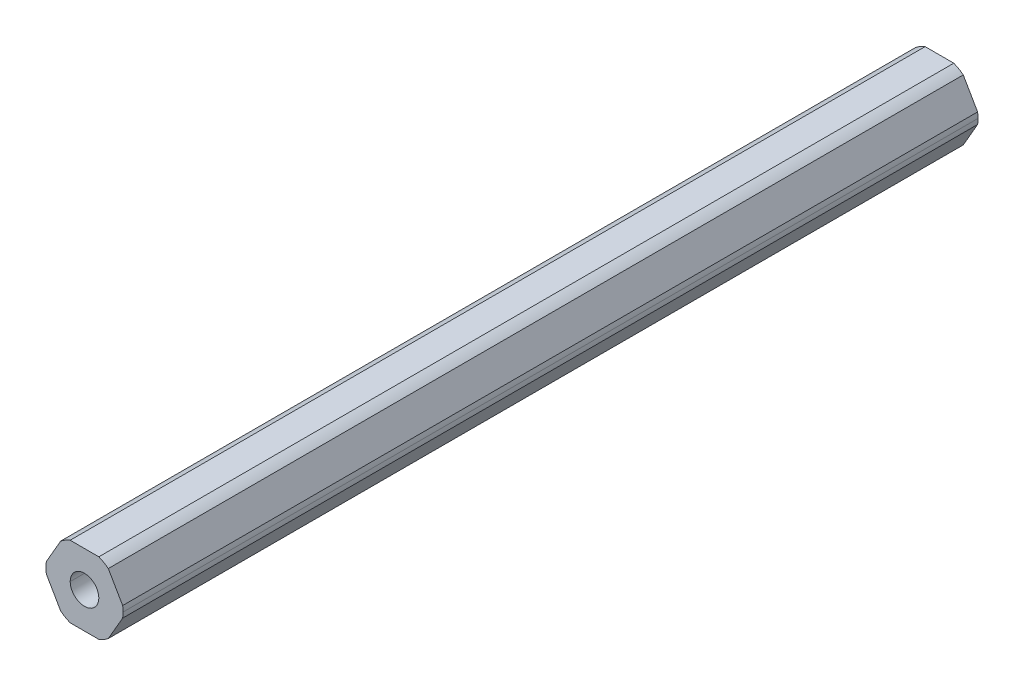
ISO-10303-21;
HEADER;
FILE_DESCRIPTION(('STEP AP214'),'2;1');
FILE_NAME('part.step','',(''),(''),'','','');
FILE_SCHEMA(('AUTOMOTIVE_DESIGN { 1 0 10303 214 1 1 1 1 }'));
ENDSEC;
DATA;
#1=APPLICATION_CONTEXT('core data for automotive mechanical design processes');
#2=APPLICATION_PROTOCOL_DEFINITION('international standard','automotive_design',2000,#1);
#3=PRODUCT_CONTEXT('',#1,'mechanical');
#4=PRODUCT('Part','Part','',(#3));
#5=PRODUCT_RELATED_PRODUCT_CATEGORY('part','',(#4));
#6=PRODUCT_DEFINITION_FORMATION('','',#4);
#7=PRODUCT_DEFINITION_CONTEXT('part definition',#1,'design');
#8=PRODUCT_DEFINITION('design','',#6,#7);
#9=PRODUCT_DEFINITION_SHAPE('','',#8);
#10=(LENGTH_UNIT() NAMED_UNIT(*) SI_UNIT(.MILLI.,.METRE.));
#11=(NAMED_UNIT(*) PLANE_ANGLE_UNIT() SI_UNIT($,.RADIAN.));
#12=(NAMED_UNIT(*) SI_UNIT($,.STERADIAN.) SOLID_ANGLE_UNIT());
#13=UNCERTAINTY_MEASURE_WITH_UNIT(LENGTH_MEASURE(1.E-05),#10,'distance_accuracy_value','');
#14=(GEOMETRIC_REPRESENTATION_CONTEXT(3) GLOBAL_UNCERTAINTY_ASSIGNED_CONTEXT((#13)) GLOBAL_UNIT_ASSIGNED_CONTEXT((#10,
#11,#12)) REPRESENTATION_CONTEXT('',''));
#15=CARTESIAN_POINT('',(0.,0.,0.));
#16=DIRECTION('',(0.,0.,1.));
#17=DIRECTION('',(1.,0.,0.));
#18=AXIS2_PLACEMENT_3D('',#15,#16,#17);
#19=CARTESIAN_POINT('',(0.,0.,-457.2));
#20=DIRECTION('',(0.,0.,1.));
#21=DIRECTION('',(1.,0.,0.));
#22=AXIS2_PLACEMENT_3D('',#19,#20,#21);
#23=CYLINDRICAL_SURFACE('',#22,2.55);
#24=CARTESIAN_POINT('',(0.,0.,-304.8));
#25=DIRECTION('',(0.,0.,1.));
#26=DIRECTION('',(1.,0.,0.));
#27=AXIS2_PLACEMENT_3D('',#24,#25,#26);
#28=CIRCLE('',#27,2.55);
#29=CARTESIAN_POINT('',(2.55,0.,-304.8));
#30=VERTEX_POINT('',#29);
#31=CARTESIAN_POINT('',(-2.55,0.,-304.8));
#32=VERTEX_POINT('',#31);
#33=EDGE_CURVE('E65',#30,#32,#28,.F.);
#34=ORIENTED_EDGE('',*,*,#33,.F.);
#35=DIRECTION('',(0.,0.,1.));
#36=VECTOR('',#35,1.);
#37=CARTESIAN_POINT('',(2.55,0.,-457.2));
#38=LINE('',#37,#36);
#39=CARTESIAN_POINT('',(2.55,0.,-457.2));
#40=VERTEX_POINT('',#39);
#41=EDGE_CURVE('E168',#40,#30,#38,.T.);
#42=ORIENTED_EDGE('',*,*,#41,.F.);
#43=CARTESIAN_POINT('',(0.,0.,-457.2));
#44=DIRECTION('',(0.,0.,1.));
#45=DIRECTION('',(1.,0.,0.));
#46=AXIS2_PLACEMENT_3D('',#43,#44,#45);
#47=CIRCLE('',#46,2.55);
#48=CARTESIAN_POINT('',(-2.55,0.,-457.2));
#49=VERTEX_POINT('',#48);
#50=EDGE_CURVE('E215',#49,#40,#47,.T.);
#51=ORIENTED_EDGE('',*,*,#50,.F.);
#52=DIRECTION('',(0.,0.,1.));
#53=VECTOR('',#52,1.);
#54=CARTESIAN_POINT('',(-2.55,0.,-457.2));
#55=LINE('',#54,#53);
#56=EDGE_CURVE('E52',#49,#32,#55,.T.);
#57=ORIENTED_EDGE('',*,*,#56,.T.);
#58=EDGE_LOOP('',(#34,#42,#51,#57));
#59=FACE_BOUND('',#58,.T.);
#60=ADVANCED_FACE('F44',(#59),#23,.F.);
#61=CARTESIAN_POINT('',(0.,0.,-457.2));
#62=DIRECTION('',(0.,0.,1.));
#63=DIRECTION('',(1.,0.,0.));
#64=AXIS2_PLACEMENT_3D('',#61,#62,#63);
#65=CYLINDRICAL_SURFACE('',#64,6.87);
#66=DIRECTION('',(0.,0.,1.));
#67=VECTOR('',#66,1.);
#68=CARTESIAN_POINT('',(6.87,0.,-457.2));
#69=LINE('',#68,#67);
#70=CARTESIAN_POINT('',(6.87,0.,-457.2));
#71=VERTEX_POINT('',#70);
#72=CARTESIAN_POINT('',(6.87,0.,-304.8));
#73=VERTEX_POINT('',#72);
#74=EDGE_CURVE('E232',#71,#73,#69,.T.);
#75=ORIENTED_EDGE('',*,*,#74,.T.);
#76=CARTESIAN_POINT('',(0.,0.,-304.8));
#77=DIRECTION('',(0.,0.,1.));
#78=DIRECTION('',(1.,0.,0.));
#79=AXIS2_PLACEMENT_3D('',#76,#77,#78);
#80=CIRCLE('',#79,6.87);
#81=CARTESIAN_POINT('',(6.80102150534208,-0.971085209378955,-304.8));
#82=VERTEX_POINT('',#81);
#83=EDGE_CURVE('E325',#73,#82,#80,.F.);
#84=ORIENTED_EDGE('',*,*,#83,.T.);
#85=DIRECTION('',(0.,0.,-1.));
#86=VECTOR('',#85,1.);
#87=CARTESIAN_POINT('',(6.80102150534208,-0.971085209378962,-457.2));
#88=LINE('',#87,#86);
#89=CARTESIAN_POINT('',(6.80102150534208,-0.971085209378955,-457.2));
#90=VERTEX_POINT('',#89);
#91=EDGE_CURVE('E230',#82,#90,#88,.T.);
#92=ORIENTED_EDGE('',*,*,#91,.T.);
#93=CARTESIAN_POINT('',(0.,0.,-457.2));
#94=DIRECTION('',(0.,0.,1.));
#95=DIRECTION('',(1.,0.,0.));
#96=AXIS2_PLACEMENT_3D('',#93,#94,#95);
#97=CIRCLE('',#96,6.87);
#98=EDGE_CURVE('E236',#90,#71,#97,.T.);
#99=ORIENTED_EDGE('',*,*,#98,.T.);
#100=EDGE_LOOP('',(#75,#84,#92,#99));
#101=FACE_BOUND('',#100,.T.);
#102=ADVANCED_FACE('F365',(#101),#65,.T.);
#103=CARTESIAN_POINT('',(3.68083890619154,-6.3754,457.2));
#104=DIRECTION('',(-0.866025403784439,0.5,0.));
#105=DIRECTION('',(0.,0.,1.));
#106=AXIS2_PLACEMENT_3D('',#103,#104,#105);
#107=PLANE('',#106);
#108=DIRECTION('',(0.5,0.866025403784439,0.));
#109=VECTOR('',#108,1.);
#110=CARTESIAN_POINT('',(3.68083890619154,-6.3754,-304.8));
#111=LINE('',#110,#109);
#112=CARTESIAN_POINT('',(4.24149521323254,-5.40431479062105,-304.8));
#113=VERTEX_POINT('',#112);
#114=EDGE_CURVE('E318',#113,#82,#111,.T.);
#115=ORIENTED_EDGE('',*,*,#114,.F.);
#116=DIRECTION('',(0.,0.,1.));
#117=VECTOR('',#116,1.);
#118=CARTESIAN_POINT('',(4.24149521323255,-5.40431479062104,-457.2));
#119=LINE('',#118,#117);
#120=CARTESIAN_POINT('',(4.24149521323254,-5.40431479062105,-457.2));
#121=VERTEX_POINT('',#120);
#122=EDGE_CURVE('E225',#121,#113,#119,.T.);
#123=ORIENTED_EDGE('',*,*,#122,.F.);
#124=DIRECTION('',(0.5,0.866025403784439,0.));
#125=VECTOR('',#124,1.);
#126=CARTESIAN_POINT('',(3.68083890619154,-6.3754,-457.2));
#127=LINE('',#126,#125);
#128=EDGE_CURVE('E206',#121,#90,#127,.T.);
#129=ORIENTED_EDGE('',*,*,#128,.T.);
#130=ORIENTED_EDGE('',*,*,#91,.F.);
#131=EDGE_LOOP('',(#115,#123,#129,#130));
#132=FACE_BOUND('',#131,.T.);
#133=ADVANCED_FACE('F363',(#132),#107,.F.);
#134=CARTESIAN_POINT('',(7.36167781238308,0.,457.2));
#135=DIRECTION('',(-0.866025403784439,-0.5,0.));
#136=DIRECTION('',(-0.5,0.866025403784439,0.));
#137=AXIS2_PLACEMENT_3D('',#134,#135,#136);
#138=PLANE('',#137);
#139=DIRECTION('',(-0.5,0.866025403784439,0.));
#140=VECTOR('',#139,1.);
#141=CARTESIAN_POINT('',(7.36167781238308,0.,-304.8));
#142=LINE('',#141,#140);
#143=CARTESIAN_POINT('',(6.80102150534208,0.97108520937895,-304.8));
#144=VERTEX_POINT('',#143);
#145=CARTESIAN_POINT('',(4.24149521323254,5.40431479062105,-304.8));
#146=VERTEX_POINT('',#145);
#147=EDGE_CURVE('E59',#144,#146,#142,.T.);
#148=ORIENTED_EDGE('',*,*,#147,.F.);
#149=DIRECTION('',(0.,0.,1.));
#150=VECTOR('',#149,1.);
#151=CARTESIAN_POINT('',(6.80102150534208,0.971085209378949,-457.2));
#152=LINE('',#151,#150);
#153=CARTESIAN_POINT('',(6.80102150534208,0.97108520937895,-457.2));
#154=VERTEX_POINT('',#153);
#155=EDGE_CURVE('E229',#154,#144,#152,.T.);
#156=ORIENTED_EDGE('',*,*,#155,.F.);
#157=DIRECTION('',(-0.5,0.866025403784439,0.));
#158=VECTOR('',#157,1.);
#159=CARTESIAN_POINT('',(7.36167781238308,0.,-457.2));
#160=LINE('',#159,#158);
#161=CARTESIAN_POINT('',(4.24149521323254,5.40431479062105,-457.2));
#162=VERTEX_POINT('',#161);
#163=EDGE_CURVE('E202',#154,#162,#160,.T.);
#164=ORIENTED_EDGE('',*,*,#163,.T.);
#165=DIRECTION('',(0.,0.,-1.));
#166=VECTOR('',#165,1.);
#167=CARTESIAN_POINT('',(4.24149521323254,5.40431479062105,-457.2));
#168=LINE('',#167,#166);
#169=EDGE_CURVE('E190',#146,#162,#168,.T.);
#170=ORIENTED_EDGE('',*,*,#169,.F.);
#171=EDGE_LOOP('',(#148,#156,#164,#170));
#172=FACE_BOUND('',#171,.T.);
#173=ADVANCED_FACE('F260',(#172),#138,.F.);
#174=CARTESIAN_POINT('',(3.68083890619154,6.3754,457.2));
#175=DIRECTION('',(0.,-1.,0.));
#176=DIRECTION('',(0.,0.,-1.));
#177=AXIS2_PLACEMENT_3D('',#174,#175,#176);
#178=PLANE('',#177);
#179=DIRECTION('',(-1.,0.,0.));
#180=VECTOR('',#179,1.);
#181=CARTESIAN_POINT('',(3.68083890619154,6.3754,-304.8));
#182=LINE('',#181,#180);
#183=CARTESIAN_POINT('',(2.55952629210953,6.3754,-304.8));
#184=VERTEX_POINT('',#183);
#185=CARTESIAN_POINT('',(-2.55952629210953,6.3754,-304.8));
#186=VERTEX_POINT('',#185);
#187=EDGE_CURVE('E335',#184,#186,#182,.T.);
#188=ORIENTED_EDGE('',*,*,#187,.F.);
#189=DIRECTION('',(0.,0.,1.));
#190=VECTOR('',#189,1.);
#191=CARTESIAN_POINT('',(2.55952629210952,6.3754,-457.2));
#192=LINE('',#191,#190);
#193=CARTESIAN_POINT('',(2.55952629210952,6.3754,-457.2));
#194=VERTEX_POINT('',#193);
#195=EDGE_CURVE('E177',#194,#184,#192,.T.);
#196=ORIENTED_EDGE('',*,*,#195,.F.);
#197=DIRECTION('',(-1.,0.,0.));
#198=VECTOR('',#197,1.);
#199=CARTESIAN_POINT('',(3.68083890619154,6.3754,-457.2));
#200=LINE('',#199,#198);
#201=CARTESIAN_POINT('',(-2.55952629210953,6.3754,-457.2));
#202=VERTEX_POINT('',#201);
#203=EDGE_CURVE('E207',#194,#202,#200,.T.);
#204=ORIENTED_EDGE('',*,*,#203,.T.);
#205=DIRECTION('',(0.,0.,-1.));
#206=VECTOR('',#205,1.);
#207=CARTESIAN_POINT('',(-2.55952629210953,6.3754,-457.2));
#208=LINE('',#207,#206);
#209=EDGE_CURVE('E192',#186,#202,#208,.T.);
#210=ORIENTED_EDGE('',*,*,#209,.F.);
#211=EDGE_LOOP('',(#188,#196,#204,#210));
#212=FACE_BOUND('',#211,.T.);
#213=ADVANCED_FACE('F341',(#212),#178,.F.);
#214=CARTESIAN_POINT('',(-3.68083890619154,6.3754,457.2));
#215=DIRECTION('',(0.866025403784439,-0.5,0.));
#216=DIRECTION('',(0.,0.,-1.));
#217=AXIS2_PLACEMENT_3D('',#214,#215,#216);
#218=PLANE('',#217);
#219=DIRECTION('',(-0.5,-0.866025403784439,0.));
#220=VECTOR('',#219,1.);
#221=CARTESIAN_POINT('',(-3.68083890619154,6.3754,-304.8));
#222=LINE('',#221,#220);
#223=CARTESIAN_POINT('',(-4.24149521323255,5.40431479062105,-304.8));
#224=VERTEX_POINT('',#223);
#225=CARTESIAN_POINT('',(-6.80102150534207,0.97108520937896,-304.8));
#226=VERTEX_POINT('',#225);
#227=EDGE_CURVE('E328',#224,#226,#222,.T.);
#228=ORIENTED_EDGE('',*,*,#227,.F.);
#229=DIRECTION('',(0.,0.,1.));
#230=VECTOR('',#229,1.);
#231=CARTESIAN_POINT('',(-4.24149521323255,5.40431479062105,-457.2));
#232=LINE('',#231,#230);
#233=CARTESIAN_POINT('',(-4.24149521323255,5.40431479062105,-457.2));
#234=VERTEX_POINT('',#233);
#235=EDGE_CURVE('E275',#234,#224,#232,.T.);
#236=ORIENTED_EDGE('',*,*,#235,.F.);
#237=DIRECTION('',(-0.5,-0.866025403784439,0.));
#238=VECTOR('',#237,1.);
#239=CARTESIAN_POINT('',(-3.68083890619154,6.3754,-457.2));
#240=LINE('',#239,#238);
#241=CARTESIAN_POINT('',(-6.80102150534208,0.97108520937896,-457.2));
#242=VERTEX_POINT('',#241);
#243=EDGE_CURVE('E211',#234,#242,#240,.T.);
#244=ORIENTED_EDGE('',*,*,#243,.T.);
#245=DIRECTION('',(0.,0.,-1.));
#246=VECTOR('',#245,1.);
#247=CARTESIAN_POINT('',(-6.80102150534208,0.97108520937896,-457.2));
#248=LINE('',#247,#246);
#249=EDGE_CURVE('E221',#226,#242,#248,.T.);
#250=ORIENTED_EDGE('',*,*,#249,.F.);
#251=EDGE_LOOP('',(#228,#236,#244,#250));
#252=FACE_BOUND('',#251,.T.);
#253=ADVANCED_FACE('F347',(#252),#218,.F.);
#254=CARTESIAN_POINT('',(-7.36167781238308,0.,457.2));
#255=DIRECTION('',(0.866025403784439,0.5,0.));
#256=DIRECTION('',(0.,0.,-1.));
#257=AXIS2_PLACEMENT_3D('',#254,#255,#256);
#258=PLANE('',#257);
#259=DIRECTION('',(0.5,-0.866025403784439,0.));
#260=VECTOR('',#259,1.);
#261=CARTESIAN_POINT('',(-7.36167781238308,0.,-304.8));
#262=LINE('',#261,#260);
#263=CARTESIAN_POINT('',(-6.80102150534208,-0.971085209378956,-304.8));
#264=VERTEX_POINT('',#263);
#265=CARTESIAN_POINT('',(-4.24149521323254,-5.40431479062105,-304.8));
#266=VERTEX_POINT('',#265);
#267=EDGE_CURVE('E320',#264,#266,#262,.T.);
#268=ORIENTED_EDGE('',*,*,#267,.F.);
#269=DIRECTION('',(0.,0.,1.));
#270=VECTOR('',#269,1.);
#271=CARTESIAN_POINT('',(-6.80102150534208,-0.971085209378962,-457.2));
#272=LINE('',#271,#270);
#273=CARTESIAN_POINT('',(-6.80102150534208,-0.971085209378956,-457.2));
#274=VERTEX_POINT('',#273);
#275=EDGE_CURVE('E193',#274,#264,#272,.T.);
#276=ORIENTED_EDGE('',*,*,#275,.F.);
#277=DIRECTION('',(0.5,-0.866025403784439,0.));
#278=VECTOR('',#277,1.);
#279=CARTESIAN_POINT('',(-7.36167781238308,0.,-457.2));
#280=LINE('',#279,#278);
#281=CARTESIAN_POINT('',(-4.24149521323254,-5.40431479062105,-457.2));
#282=VERTEX_POINT('',#281);
#283=EDGE_CURVE('E284',#274,#282,#280,.T.);
#284=ORIENTED_EDGE('',*,*,#283,.T.);
#285=DIRECTION('',(0.,0.,-1.));
#286=VECTOR('',#285,1.);
#287=CARTESIAN_POINT('',(-4.24149521323255,-5.40431479062104,-457.2));
#288=LINE('',#287,#286);
#289=EDGE_CURVE('E201',#266,#282,#288,.T.);
#290=ORIENTED_EDGE('',*,*,#289,.F.);
#291=EDGE_LOOP('',(#268,#276,#284,#290));
#292=FACE_BOUND('',#291,.T.);
#293=ADVANCED_FACE('F353',(#292),#258,.F.);
#294=CARTESIAN_POINT('',(-3.68083890619154,-6.3754,457.2));
#295=DIRECTION('',(0.,1.,0.));
#296=DIRECTION('',(1.,0.,0.));
#297=AXIS2_PLACEMENT_3D('',#294,#295,#296);
#298=PLANE('',#297);
#299=DIRECTION('',(1.,0.,0.));
#300=VECTOR('',#299,1.);
#301=CARTESIAN_POINT('',(-3.68083890619154,-6.3754,-304.8));
#302=LINE('',#301,#300);
#303=CARTESIAN_POINT('',(-2.55952629210953,-6.3754,-304.8));
#304=VERTEX_POINT('',#303);
#305=CARTESIAN_POINT('',(2.55952629210953,-6.3754,-304.8));
#306=VERTEX_POINT('',#305);
#307=EDGE_CURVE('E178',#304,#306,#302,.T.);
#308=ORIENTED_EDGE('',*,*,#307,.F.);
#309=DIRECTION('',(0.,0.,1.));
#310=VECTOR('',#309,1.);
#311=CARTESIAN_POINT('',(-2.55952629210953,-6.3754,-457.2));
#312=LINE('',#311,#310);
#313=CARTESIAN_POINT('',(-2.55952629210953,-6.3754,-457.2));
#314=VERTEX_POINT('',#313);
#315=EDGE_CURVE('E216',#314,#304,#312,.T.);
#316=ORIENTED_EDGE('',*,*,#315,.F.);
#317=DIRECTION('',(1.,0.,0.));
#318=VECTOR('',#317,1.);
#319=CARTESIAN_POINT('',(-3.68083890619154,-6.3754,-457.2));
#320=LINE('',#319,#318);
#321=CARTESIAN_POINT('',(2.55952629210953,-6.3754,-457.2));
#322=VERTEX_POINT('',#321);
#323=EDGE_CURVE('E214',#314,#322,#320,.T.);
#324=ORIENTED_EDGE('',*,*,#323,.T.);
#325=DIRECTION('',(0.,0.,-1.));
#326=VECTOR('',#325,1.);
#327=CARTESIAN_POINT('',(2.55952629210953,-6.3754,-457.2));
#328=LINE('',#327,#326);
#329=EDGE_CURVE('E200',#306,#322,#328,.T.);
#330=ORIENTED_EDGE('',*,*,#329,.F.);
#331=EDGE_LOOP('',(#308,#316,#324,#330));
#332=FACE_BOUND('',#331,.T.);
#333=ADVANCED_FACE('F357',(#332),#298,.F.);
#334=CARTESIAN_POINT('',(0.,0.,-457.2));
#335=DIRECTION('',(0.,0.,1.));
#336=DIRECTION('',(1.,0.,0.));
#337=AXIS2_PLACEMENT_3D('',#334,#335,#336);
#338=CYLINDRICAL_SURFACE('',#337,6.87);
#339=ORIENTED_EDGE('',*,*,#155,.T.);
#340=CARTESIAN_POINT('',(0.,0.,-304.8));
#341=DIRECTION('',(0.,0.,1.));
#342=DIRECTION('',(1.,0.,0.));
#343=AXIS2_PLACEMENT_3D('',#340,#341,#342);
#344=CIRCLE('',#343,6.87);
#345=EDGE_CURVE('E257',#144,#73,#344,.F.);
#346=ORIENTED_EDGE('',*,*,#345,.T.);
#347=ORIENTED_EDGE('',*,*,#74,.F.);
#348=CARTESIAN_POINT('',(0.,0.,-457.2));
#349=DIRECTION('',(0.,0.,1.));
#350=DIRECTION('',(1.,0.,0.));
#351=AXIS2_PLACEMENT_3D('',#348,#349,#350);
#352=CIRCLE('',#351,6.87);
#353=EDGE_CURVE('E224',#71,#154,#352,.T.);
#354=ORIENTED_EDGE('',*,*,#353,.T.);
#355=EDGE_LOOP('',(#339,#346,#347,#354));
#356=FACE_BOUND('',#355,.T.);
#357=ADVANCED_FACE('F256',(#356),#338,.T.);
#358=CARTESIAN_POINT('',(0.,0.,-457.2));
#359=DIRECTION('',(0.,0.,1.));
#360=DIRECTION('',(1.,0.,0.));
#361=AXIS2_PLACEMENT_3D('',#358,#359,#360);
#362=CYLINDRICAL_SURFACE('',#361,6.87);
#363=ORIENTED_EDGE('',*,*,#122,.T.);
#364=CARTESIAN_POINT('',(0.,0.,-304.8));
#365=DIRECTION('',(0.,0.,1.));
#366=DIRECTION('',(1.,0.,0.));
#367=AXIS2_PLACEMENT_3D('',#364,#365,#366);
#368=CIRCLE('',#367,6.87);
#369=EDGE_CURVE('E186',#113,#306,#368,.F.);
#370=ORIENTED_EDGE('',*,*,#369,.T.);
#371=ORIENTED_EDGE('',*,*,#329,.T.);
#372=CARTESIAN_POINT('',(0.,0.,-457.2));
#373=DIRECTION('',(0.,0.,1.));
#374=DIRECTION('',(1.,0.,0.));
#375=AXIS2_PLACEMENT_3D('',#372,#373,#374);
#376=CIRCLE('',#375,6.87);
#377=EDGE_CURVE('E196',#322,#121,#376,.T.);
#378=ORIENTED_EDGE('',*,*,#377,.T.);
#379=EDGE_LOOP('',(#363,#370,#371,#378));
#380=FACE_BOUND('',#379,.T.);
#381=ADVANCED_FACE('F359',(#380),#362,.T.);
#382=CARTESIAN_POINT('',(0.,0.,-457.2));
#383=DIRECTION('',(0.,0.,1.));
#384=DIRECTION('',(1.,0.,0.));
#385=AXIS2_PLACEMENT_3D('',#382,#383,#384);
#386=CYLINDRICAL_SURFACE('',#385,6.87);
#387=ORIENTED_EDGE('',*,*,#315,.T.);
#388=CARTESIAN_POINT('',(0.,0.,-304.8));
#389=DIRECTION('',(0.,0.,1.));
#390=DIRECTION('',(1.,0.,0.));
#391=AXIS2_PLACEMENT_3D('',#388,#389,#390);
#392=CIRCLE('',#391,6.87);
#393=EDGE_CURVE('E315',#304,#266,#392,.F.);
#394=ORIENTED_EDGE('',*,*,#393,.T.);
#395=ORIENTED_EDGE('',*,*,#289,.T.);
#396=CARTESIAN_POINT('',(0.,0.,-457.2));
#397=DIRECTION('',(0.,0.,1.));
#398=DIRECTION('',(1.,0.,0.));
#399=AXIS2_PLACEMENT_3D('',#396,#397,#398);
#400=CIRCLE('',#399,6.87);
#401=EDGE_CURVE('E220',#282,#314,#400,.T.);
#402=ORIENTED_EDGE('',*,*,#401,.T.);
#403=EDGE_LOOP('',(#387,#394,#395,#402));
#404=FACE_BOUND('',#403,.T.);
#405=ADVANCED_FACE('F355',(#404),#386,.T.);
#406=CARTESIAN_POINT('',(0.,0.,-457.2));
#407=DIRECTION('',(0.,0.,1.));
#408=DIRECTION('',(1.,0.,0.));
#409=AXIS2_PLACEMENT_3D('',#406,#407,#408);
#410=CYLINDRICAL_SURFACE('',#409,6.87);
#411=ORIENTED_EDGE('',*,*,#275,.T.);
#412=CARTESIAN_POINT('',(0.,0.,-304.8));
#413=DIRECTION('',(0.,0.,1.));
#414=DIRECTION('',(1.,0.,0.));
#415=AXIS2_PLACEMENT_3D('',#412,#413,#414);
#416=CIRCLE('',#415,6.87);
#417=EDGE_CURVE('E322',#264,#226,#416,.F.);
#418=ORIENTED_EDGE('',*,*,#417,.T.);
#419=ORIENTED_EDGE('',*,*,#249,.T.);
#420=CARTESIAN_POINT('',(0.,0.,-457.2));
#421=DIRECTION('',(0.,0.,1.));
#422=DIRECTION('',(1.,0.,0.));
#423=AXIS2_PLACEMENT_3D('',#420,#421,#422);
#424=CIRCLE('',#423,6.87);
#425=EDGE_CURVE('E285',#242,#274,#424,.T.);
#426=ORIENTED_EDGE('',*,*,#425,.T.);
#427=EDGE_LOOP('',(#411,#418,#419,#426));
#428=FACE_BOUND('',#427,.T.);
#429=ADVANCED_FACE('F46',(#428),#410,.T.);
#430=CARTESIAN_POINT('',(0.,0.,-457.2));
#431=DIRECTION('',(0.,0.,1.));
#432=DIRECTION('',(1.,0.,0.));
#433=AXIS2_PLACEMENT_3D('',#430,#431,#432);
#434=CYLINDRICAL_SURFACE('',#433,6.87);
#435=ORIENTED_EDGE('',*,*,#235,.T.);
#436=CARTESIAN_POINT('',(0.,0.,-304.8));
#437=DIRECTION('',(0.,0.,1.));
#438=DIRECTION('',(1.,0.,0.));
#439=AXIS2_PLACEMENT_3D('',#436,#437,#438);
#440=CIRCLE('',#439,6.87);
#441=EDGE_CURVE('E331',#224,#186,#440,.F.);
#442=ORIENTED_EDGE('',*,*,#441,.T.);
#443=ORIENTED_EDGE('',*,*,#209,.T.);
#444=CARTESIAN_POINT('',(0.,0.,-457.2));
#445=DIRECTION('',(0.,0.,1.));
#446=DIRECTION('',(1.,0.,0.));
#447=AXIS2_PLACEMENT_3D('',#444,#445,#446);
#448=CIRCLE('',#447,6.87);
#449=EDGE_CURVE('E194',#202,#234,#448,.T.);
#450=ORIENTED_EDGE('',*,*,#449,.T.);
#451=EDGE_LOOP('',(#435,#442,#443,#450));
#452=FACE_BOUND('',#451,.T.);
#453=ADVANCED_FACE('F343',(#452),#434,.T.);
#454=CARTESIAN_POINT('',(0.,0.,-457.2));
#455=DIRECTION('',(0.,0.,1.));
#456=DIRECTION('',(1.,0.,0.));
#457=AXIS2_PLACEMENT_3D('',#454,#455,#456);
#458=CYLINDRICAL_SURFACE('',#457,6.87);
#459=ORIENTED_EDGE('',*,*,#195,.T.);
#460=CARTESIAN_POINT('',(0.,0.,-304.8));
#461=DIRECTION('',(0.,0.,1.));
#462=DIRECTION('',(1.,0.,0.));
#463=AXIS2_PLACEMENT_3D('',#460,#461,#462);
#464=CIRCLE('',#463,6.87);
#465=EDGE_CURVE('E170',#184,#146,#464,.F.);
#466=ORIENTED_EDGE('',*,*,#465,.T.);
#467=ORIENTED_EDGE('',*,*,#169,.T.);
#468=CARTESIAN_POINT('',(0.,0.,-457.2));
#469=DIRECTION('',(0.,0.,1.));
#470=DIRECTION('',(1.,0.,0.));
#471=AXIS2_PLACEMENT_3D('',#468,#469,#470);
#472=CIRCLE('',#471,6.87);
#473=EDGE_CURVE('E184',#162,#194,#472,.T.);
#474=ORIENTED_EDGE('',*,*,#473,.T.);
#475=EDGE_LOOP('',(#459,#466,#467,#474));
#476=FACE_BOUND('',#475,.T.);
#477=ADVANCED_FACE('F337',(#476),#458,.T.);
#478=CARTESIAN_POINT('',(0.,0.,-457.2));
#479=DIRECTION('',(0.,0.,1.));
#480=DIRECTION('',(1.,0.,0.));
#481=AXIS2_PLACEMENT_3D('',#478,#479,#480);
#482=CYLINDRICAL_SURFACE('',#481,2.55);
#483=CARTESIAN_POINT('',(0.,0.,-304.8));
#484=DIRECTION('',(0.,0.,1.));
#485=DIRECTION('',(1.,0.,0.));
#486=AXIS2_PLACEMENT_3D('',#483,#484,#485);
#487=CIRCLE('',#486,2.55);
#488=EDGE_CURVE('E11',#32,#30,#487,.F.);
#489=ORIENTED_EDGE('',*,*,#488,.F.);
#490=ORIENTED_EDGE('',*,*,#56,.F.);
#491=CARTESIAN_POINT('',(0.,0.,-457.2));
#492=DIRECTION('',(0.,0.,1.));
#493=DIRECTION('',(1.,0.,0.));
#494=AXIS2_PLACEMENT_3D('',#491,#492,#493);
#495=CIRCLE('',#494,2.55);
#496=EDGE_CURVE('E175',#40,#49,#495,.T.);
#497=ORIENTED_EDGE('',*,*,#496,.F.);
#498=ORIENTED_EDGE('',*,*,#41,.T.);
#499=EDGE_LOOP('',(#489,#490,#497,#498));
#500=FACE_BOUND('',#499,.T.);
#501=ADVANCED_FACE('F173',(#500),#482,.F.);
#502=CARTESIAN_POINT('',(0.,0.,-457.2));
#503=DIRECTION('',(0.,0.,1.));
#504=DIRECTION('',(1.,0.,0.));
#505=AXIS2_PLACEMENT_3D('',#502,#503,#504);
#506=PLANE('',#505);
#507=ORIENTED_EDGE('',*,*,#473,.F.);
#508=ORIENTED_EDGE('',*,*,#163,.F.);
#509=ORIENTED_EDGE('',*,*,#353,.F.);
#510=ORIENTED_EDGE('',*,*,#98,.F.);
#511=ORIENTED_EDGE('',*,*,#128,.F.);
#512=ORIENTED_EDGE('',*,*,#377,.F.);
#513=ORIENTED_EDGE('',*,*,#323,.F.);
#514=ORIENTED_EDGE('',*,*,#401,.F.);
#515=ORIENTED_EDGE('',*,*,#283,.F.);
#516=ORIENTED_EDGE('',*,*,#425,.F.);
#517=ORIENTED_EDGE('',*,*,#243,.F.);
#518=ORIENTED_EDGE('',*,*,#449,.F.);
#519=ORIENTED_EDGE('',*,*,#203,.F.);
#520=EDGE_LOOP('',(#507,#508,#509,#510,#511,#512,#513,#514,#515,#516,#517,#518,#519));
#521=FACE_BOUND('',#520,.T.);
#522=ORIENTED_EDGE('',*,*,#496,.T.);
#523=ORIENTED_EDGE('',*,*,#50,.T.);
#524=EDGE_LOOP('',(#522,#523));
#525=FACE_BOUND('',#524,.T.);
#526=ADVANCED_FACE('F264',(#521,#525),#506,.F.);
#527=CARTESIAN_POINT('',(0.,0.,-304.8));
#528=DIRECTION('',(0.,0.,1.));
#529=DIRECTION('',(1.,0.,0.));
#530=AXIS2_PLACEMENT_3D('',#527,#528,#529);
#531=PLANE('',#530);
#532=ORIENTED_EDGE('',*,*,#33,.T.);
#533=ORIENTED_EDGE('',*,*,#488,.T.);
#534=EDGE_LOOP('',(#532,#533));
#535=FACE_BOUND('',#534,.T.);
#536=ORIENTED_EDGE('',*,*,#307,.T.);
#537=ORIENTED_EDGE('',*,*,#369,.F.);
#538=ORIENTED_EDGE('',*,*,#114,.T.);
#539=ORIENTED_EDGE('',*,*,#83,.F.);
#540=ORIENTED_EDGE('',*,*,#345,.F.);
#541=ORIENTED_EDGE('',*,*,#147,.T.);
#542=ORIENTED_EDGE('',*,*,#465,.F.);
#543=ORIENTED_EDGE('',*,*,#187,.T.);
#544=ORIENTED_EDGE('',*,*,#441,.F.);
#545=ORIENTED_EDGE('',*,*,#227,.T.);
#546=ORIENTED_EDGE('',*,*,#417,.F.);
#547=ORIENTED_EDGE('',*,*,#267,.T.);
#548=ORIENTED_EDGE('',*,*,#393,.F.);
#549=EDGE_LOOP('',(#536,#537,#538,#539,#540,#541,#542,#543,#544,#545,#546,#547,#548));
#550=FACE_BOUND('',#549,.T.);
#551=ADVANCED_FACE('F162',(#535,#550),#531,.T.);
#552=CLOSED_SHELL('',(#60,#102,#133,#173,#213,#253,#293,#333,#357,#381,#405,#429,#453,#477,#501,
#526,#551));
#553=MANIFOLD_SOLID_BREP('B2',#552);
#554=ADVANCED_BREP_SHAPE_REPRESENTATION('',(#18,#553),#14);
#555=SHAPE_DEFINITION_REPRESENTATION(#9,#554);
ENDSEC;
END-ISO-10303-21;
